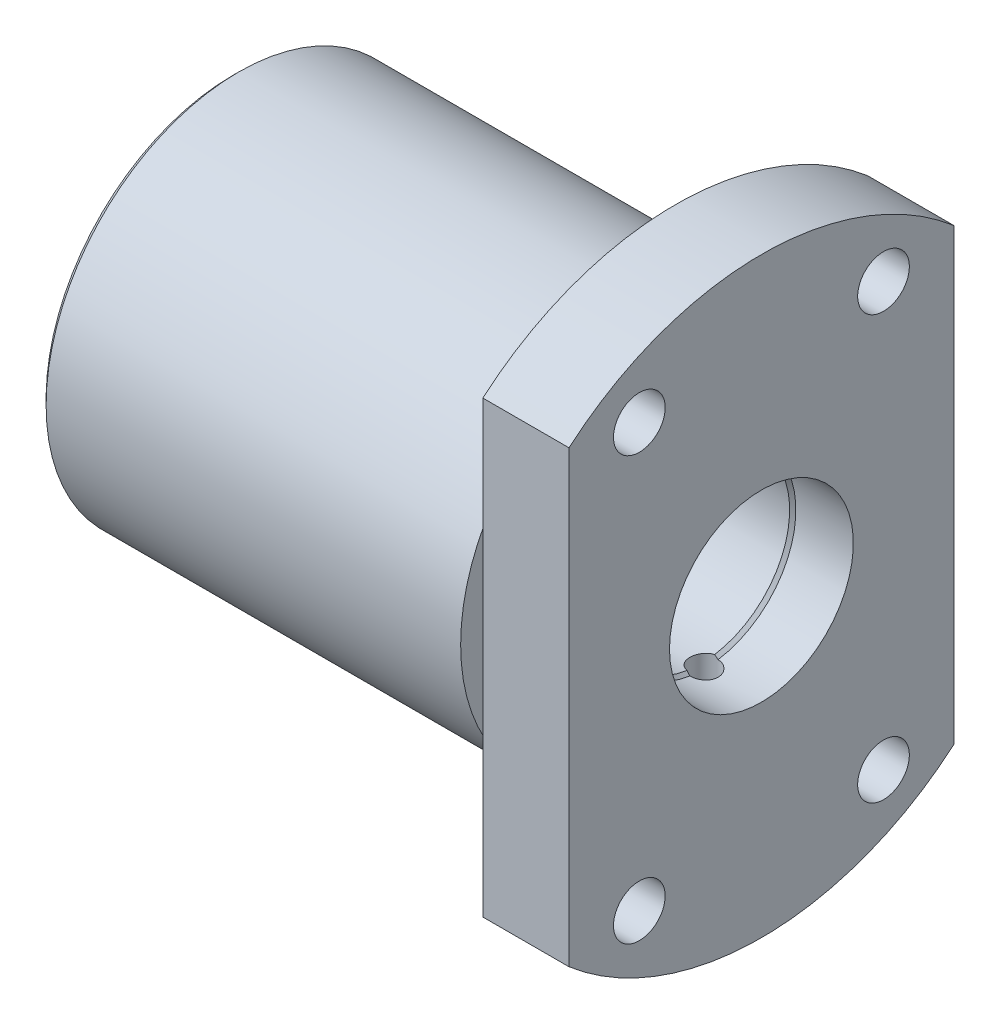
ISO-10303-21;
HEADER;
FILE_DESCRIPTION(('STEP AP214'),'2;1');
FILE_NAME('part.step','',(''),(''),'','','');
FILE_SCHEMA(('AUTOMOTIVE_DESIGN { 1 0 10303 214 1 1 1 1 }'));
ENDSEC;
DATA;
#1=APPLICATION_CONTEXT('core data for automotive mechanical design processes');
#2=APPLICATION_PROTOCOL_DEFINITION('international standard','automotive_design',2000,#1);
#3=PRODUCT_CONTEXT('',#1,'mechanical');
#4=PRODUCT('Part','Part','',(#3));
#5=PRODUCT_RELATED_PRODUCT_CATEGORY('part','',(#4));
#6=PRODUCT_DEFINITION_FORMATION('','',#4);
#7=PRODUCT_DEFINITION_CONTEXT('part definition',#1,'design');
#8=PRODUCT_DEFINITION('design','',#6,#7);
#9=PRODUCT_DEFINITION_SHAPE('','',#8);
#10=(LENGTH_UNIT() NAMED_UNIT(*) SI_UNIT(.MILLI.,.METRE.));
#11=(NAMED_UNIT(*) PLANE_ANGLE_UNIT() SI_UNIT($,.RADIAN.));
#12=(NAMED_UNIT(*) SI_UNIT($,.STERADIAN.) SOLID_ANGLE_UNIT());
#13=UNCERTAINTY_MEASURE_WITH_UNIT(LENGTH_MEASURE(1.E-05),#10,'distance_accuracy_value','');
#14=(GEOMETRIC_REPRESENTATION_CONTEXT(3) GLOBAL_UNCERTAINTY_ASSIGNED_CONTEXT((#13)) GLOBAL_UNIT_ASSIGNED_CONTEXT((#10,
#11,#12)) REPRESENTATION_CONTEXT('',''));
#15=CARTESIAN_POINT('',(0.,0.,0.));
#16=DIRECTION('',(0.,0.,1.));
#17=DIRECTION('',(1.,0.,0.));
#18=AXIS2_PLACEMENT_3D('',#15,#16,#17);
#19=CARTESIAN_POINT('',(92.,0.,0.));
#20=DIRECTION('',(-1.,0.,0.));
#21=DIRECTION('',(0.,0.,1.));
#22=AXIS2_PLACEMENT_3D('',#19,#20,#21);
#23=CYLINDRICAL_SURFACE('',#22,16.);
#24=CARTESIAN_POINT('',(82.,-15.8099898086621,-2.4585));
#25=CARTESIAN_POINT('',(82.0687127932219,-15.8099853369769,-2.45850709908203));
#26=CARTESIAN_POINT('',(82.1374218844522,-15.8104376681935,-2.45561937153529));
#27=CARTESIAN_POINT('',(82.274340392991,-15.8122228647086,-2.44410927692438));
#28=CARTESIAN_POINT('',(82.3425498557513,-15.8135556488796,-2.4354874382172));
#29=CARTESIAN_POINT('',(82.4779093463013,-15.8170666072887,-2.41257771234252));
#30=CARTESIAN_POINT('',(82.5450605348417,-15.8192437768267,-2.39829655852815));
#31=CARTESIAN_POINT('',(82.6778899066993,-15.8243767300692,-2.36419031468206));
#32=CARTESIAN_POINT('',(82.7435680940098,-15.8273325116625,-2.34436523968247));
#33=CARTESIAN_POINT('',(82.9377342524061,-15.8372500387394,-2.27675612791005));
#34=CARTESIAN_POINT('',(83.0634403664738,-15.8452643707128,-2.22082345691879));
#35=CARTESIAN_POINT('',(83.3036133103238,-15.8631896141636,-2.08892663909235));
#36=CARTESIAN_POINT('',(83.4180803435351,-15.8731004913037,-2.0129628549149));
#37=CARTESIAN_POINT('',(83.6335648134979,-15.8937949888385,-1.84246859647142));
#38=CARTESIAN_POINT('',(83.7344764110345,-15.9045845269224,-1.74780483781432));
#39=CARTESIAN_POINT('',(83.9190533772389,-15.9257687684075,-1.5428803625888));
#40=CARTESIAN_POINT('',(84.0027161087039,-15.9361634112347,-1.43261726535531));
#41=CARTESIAN_POINT('',(84.1508110118294,-15.9554483107654,-1.19894157016582));
#42=CARTESIAN_POINT('',(84.2151443513763,-15.9643307385627,-1.07546562858151));
#43=CARTESIAN_POINT('',(84.3221146415374,-15.979523602744,-0.81930871995009));
#44=CARTESIAN_POINT('',(84.364754044294,-15.9858343298004,-0.686628795189169));
#45=CARTESIAN_POINT('',(84.4268062669338,-15.9951312792428,-0.416929076835142));
#46=CARTESIAN_POINT('',(84.4463988381992,-15.9981432172935,-0.27995154159092));
#47=CARTESIAN_POINT('',(84.4623595199437,-16.0005914392365,-0.00461897953302182));
#48=CARTESIAN_POINT('',(84.4587284273068,-16.0000278458177,0.133735999853151));
#49=CARTESIAN_POINT('',(84.4284855469094,-15.9954088803262,0.406661894879526));
#50=CARTESIAN_POINT('',(84.402067787045,-15.9913829904713,0.541254880676761));
#51=CARTESIAN_POINT('',(84.3273063770136,-15.9803246740559,0.804073709817868));
#52=CARTESIAN_POINT('',(84.2789622728503,-15.9732921852425,0.932299421263018));
#53=CARTESIAN_POINT('',(84.1615221571028,-15.9569601320095,1.17933201702674));
#54=CARTESIAN_POINT('',(84.0923444521267,-15.9476516705098,1.29809945164167));
#55=CARTESIAN_POINT('',(83.9352630915317,-15.927804930736,1.52240874270513));
#56=CARTESIAN_POINT('',(83.8473588718804,-15.9172666154238,1.62795020064245));
#57=CARTESIAN_POINT('',(83.6542535085562,-15.8960073393087,1.82394807290087));
#58=CARTESIAN_POINT('',(83.5488851508255,-15.8852856117846,1.91423971597243));
#59=CARTESIAN_POINT('',(83.3243676110274,-15.864969386389,2.07591160506983));
#60=CARTESIAN_POINT('',(83.2052144629526,-15.8553752145339,2.14728638901128));
#61=CARTESIAN_POINT('',(82.9563173112036,-15.8383991045331,2.26912272521137));
#62=CARTESIAN_POINT('',(82.8265585055558,-15.8310203278082,2.31955443013077));
#63=CARTESIAN_POINT('',(82.5603642503339,-15.8193614312876,2.39778957040648));
#64=CARTESIAN_POINT('',(82.4239391305688,-15.8150766701449,2.4256269074916));
#65=CARTESIAN_POINT('',(82.2387461322743,-15.8117199268001,2.44735119459202));
#66=CARTESIAN_POINT('',(82.1910527712408,-15.8110716699053,2.45153382926008));
#67=CARTESIAN_POINT('',(82.0955798191938,-15.8102070714925,2.4571045549549));
#68=CARTESIAN_POINT('',(82.0478005090117,-15.8099900038258,2.45849734428252));
#69=CARTESIAN_POINT('',(82.,-15.8099898086621,2.4585));
#70=B_SPLINE_CURVE_WITH_KNOTS('',3,(#24,#25,#26,#27,#28,#29,#30,#31,#32,#33,#34,#35,#36,#37,#38,
#39,#40,#41,#42,#43,#44,#45,#46,#47,#48,#49,#50,#51,#52,#53,#54,#55,#56,#57,#58,#59,#60,#61,#62,
#63,#64,#65,#66,#67,#68,#69),.UNSPECIFIED.,.F.,.F.,(4,2,2,2,2,2,2,2,2,2,2,2,2,2,2,2,2,2,2,2,2,2,
4),(0.,0.206069692791579,0.412120400377608,0.617926685001745,0.823732411595953,1.23508370058208,
1.64642754267889,2.06081652396368,2.47526881483731,2.89180550454251,3.30829510116602,
3.72151432658785,4.13471937311088,4.54444033728479,4.9541697853316,5.36552727278977,
5.77689715186033,6.19246117259498,6.60814505355324,7.02441933614168,7.44006785911574,
7.58364828127986,7.72698669967308),.UNSPECIFIED.);
#71=CARTESIAN_POINT('',(82.,-15.8099898086621,-2.4585));
#72=VERTEX_POINT('',#71);
#73=CARTESIAN_POINT('',(82.,-15.8099898086621,2.4585));
#74=VERTEX_POINT('',#73);
#75=EDGE_CURVE('E20',#72,#74,#70,.T.);
#76=ORIENTED_EDGE('',*,*,#75,.T.);
#77=CARTESIAN_POINT('',(82.,0.,0.));
#78=DIRECTION('',(1.,0.,0.));
#79=DIRECTION('',(0.,0.,-1.));
#80=AXIS2_PLACEMENT_3D('',#77,#78,#79);
#81=CIRCLE('',#80,16.);
#82=EDGE_CURVE('E72',#74,#72,#81,.F.);
#83=ORIENTED_EDGE('',*,*,#82,.T.);
#84=EDGE_LOOP('',(#76,#83));
#85=FACE_BOUND('',#84,.T.);
#86=CARTESIAN_POINT('',(92.,0.,0.));
#87=DIRECTION('',(-1.,0.,0.));
#88=DIRECTION('',(0.,0.,1.));
#89=AXIS2_PLACEMENT_3D('',#86,#87,#88);
#90=CIRCLE('',#89,16.);
#91=CARTESIAN_POINT('',(92.,0.,16.));
#92=VERTEX_POINT('',#91);
#93=EDGE_CURVE('E186',#92,#92,#90,.T.);
#94=ORIENTED_EDGE('',*,*,#93,.F.);
#95=EDGE_LOOP('',(#94));
#96=FACE_BOUND('',#95,.T.);
#97=ADVANCED_FACE('F16',(#85,#96),#23,.F.);
#98=CARTESIAN_POINT('',(82.,-51.5,0.));
#99=DIRECTION('',(0.,1.,0.));
#100=DIRECTION('',(0.,0.,1.));
#101=AXIS2_PLACEMENT_3D('',#98,#99,#100);
#102=CYLINDRICAL_SURFACE('',#101,2.4585);
#103=CARTESIAN_POINT('',(81.4585,-15.2713529934319,-2.39812426700536));
#104=CARTESIAN_POINT('',(81.3910780216789,-15.2737397803603,-2.38290725331271));
#105=CARTESIAN_POINT('',(81.3243202705034,-15.2765566884271,-2.36483821836498));
#106=CARTESIAN_POINT('',(81.1926010179986,-15.282951201384,-2.32316418537619));
#107=CARTESIAN_POINT('',(81.127639313482,-15.2865287198247,-2.29955981643812));
#108=CARTESIAN_POINT('',(81.0000295255899,-15.2943415095589,-2.24700647346991));
#109=CARTESIAN_POINT('',(80.9373791502979,-15.2985761063415,-2.2180629745285));
#110=CARTESIAN_POINT('',(80.8147753550761,-15.3075802901914,-2.15504571750805));
#111=CARTESIAN_POINT('',(80.7548219505863,-15.3123498803209,-2.12097193006309));
#112=CARTESIAN_POINT('',(80.5796148553959,-15.3272631678293,-2.01138351537136));
#113=CARTESIAN_POINT('',(80.4689219506667,-15.3380173329833,-1.92846368690663));
#114=CARTESIAN_POINT('',(80.263054892967,-15.3599300797512,-1.74535090381237));
#115=CARTESIAN_POINT('',(80.1678800634324,-15.3710886437079,-1.64515870262381));
#116=CARTESIAN_POINT('',(79.9950406752437,-15.3926428734467,-1.42953027341988));
#117=CARTESIAN_POINT('',(79.9174880879411,-15.4030333924198,-1.31400357177649));
#118=CARTESIAN_POINT('',(79.7828910171276,-15.4218062638832,-1.07139978205747));
#119=CARTESIAN_POINT('',(79.7258482542308,-15.4301884478701,-0.94432172603336));
#120=CARTESIAN_POINT('',(79.6341792172695,-15.4439649029716,-0.682805910663233));
#121=CARTESIAN_POINT('',(79.5994533871043,-15.4493724282829,-0.548403780046409));
#122=CARTESIAN_POINT('',(79.5530817816672,-15.4566450326246,-0.275594830985277));
#123=CARTESIAN_POINT('',(79.541432658045,-15.4585106255755,-0.137188596479862));
#124=CARTESIAN_POINT('',(79.5415671952511,-15.4584893968318,0.138089928819826));
#125=CARTESIAN_POINT('',(79.5530956306423,-15.4566434457059,0.274962418898962));
#126=CARTESIAN_POINT('',(79.5987222841412,-15.4494865212363,0.544805516964022));
#127=CARTESIAN_POINT('',(79.632822067685,-15.4441753075597,0.677775853648011));
#128=CARTESIAN_POINT('',(79.7225469890956,-15.4306784829631,0.936006164641517));
#129=CARTESIAN_POINT('',(79.7781616109678,-15.4224942764814,1.06126987117284));
#130=CARTESIAN_POINT('',(79.9093114727122,-15.4041482329107,1.3007209409043));
#131=CARTESIAN_POINT('',(79.9848455640972,-15.3939865098472,1.41490894217205));
#132=CARTESIAN_POINT('',(80.154625639308,-15.3726786000245,1.63028543198387));
#133=CARTESIAN_POINT('',(80.2490631562047,-15.3615230445472,1.7313217851304));
#134=CARTESIAN_POINT('',(80.4536209076665,-15.3395566172026,1.9162248711695));
#135=CARTESIAN_POINT('',(80.5637434075048,-15.3287457953993,2.00008911974228));
#136=CARTESIAN_POINT('',(80.7395307883082,-15.3135968914577,2.11197329529129));
#137=CARTESIAN_POINT('',(80.800638064607,-15.308676451702,2.14726195845542));
#138=CARTESIAN_POINT('',(80.9257089038142,-15.2993861807142,2.21248469608573));
#139=CARTESIAN_POINT('',(80.9896725125215,-15.295016358315,2.24241868465577));
#140=CARTESIAN_POINT('',(81.1200491931278,-15.2869579409856,2.29671526095564));
#141=CARTESIAN_POINT('',(81.1864650875412,-15.2832701623718,2.32107118067152));
#142=CARTESIAN_POINT('',(81.3211885140459,-15.2766888981087,2.36398924894072));
#143=CARTESIAN_POINT('',(81.3894962393417,-15.2737954939172,2.38255080334761));
#144=CARTESIAN_POINT('',(81.4585,-15.2713529934319,2.39812426700536));
#145=B_SPLINE_CURVE_WITH_KNOTS('',3,(#103,#104,#105,#106,#107,#108,#109,#110,#111,#112,#113,
#114,#115,#116,#117,#118,#119,#120,#121,#122,#123,#124,#125,#126,#127,#128,#129,#130,#131,#132,
#133,#134,#135,#136,#137,#138,#139,#140,#141,#142,#143,#144),.UNSPECIFIED.,.F.,.F.,(4,2,2,2,2,2,
2,2,2,2,2,2,2,2,2,2,2,2,2,2,4),(0.,0.207406012139597,0.414788463539823,0.621959422004962,
0.829131566368304,1.24317938164911,1.65720914025122,2.07380032619091,2.49042645272517,
2.90518086178485,3.31987508700672,3.73002781633368,4.14020899478755,4.55018993821421,
4.96014724873238,5.37449023246296,5.7888931176642,6.00088401305302,6.21287830875459,
6.42512471451752,6.63739287659836),.UNSPECIFIED.);
#146=CARTESIAN_POINT('',(81.4585,-15.2713529934319,-2.39812426700536));
#147=VERTEX_POINT('',#146);
#148=CARTESIAN_POINT('',(81.4585,-15.2713529934319,2.39812426700536));
#149=VERTEX_POINT('',#148);
#150=EDGE_CURVE('E83',#147,#149,#145,.T.);
#151=ORIENTED_EDGE('',*,*,#150,.T.);
#152=CARTESIAN_POINT('',(81.4585,-15.2713529934319,2.39812426700537));
#153=CARTESIAN_POINT('',(81.5036759298067,-15.3154802436735,2.40832332934761));
#154=CARTESIAN_POINT('',(81.5488977720816,-15.3598628502402,2.41719467889737));
#155=CARTESIAN_POINT('',(81.6392848441635,-15.4489815517865,2.43232504325639));
#156=CARTESIAN_POINT('',(81.6844500475292,-15.4937169605573,2.43858825158658));
#157=CARTESIAN_POINT('',(81.7747209133983,-15.583526234397,2.44857789563526));
#158=CARTESIAN_POINT('',(81.8198265769642,-15.6286000933275,2.45230437724934));
#159=CARTESIAN_POINT('',(81.909986651207,-15.7190817890225,2.45726669444199));
#160=CARTESIAN_POINT('',(81.9550408611398,-15.7644900479091,2.45849849377948));
#161=CARTESIAN_POINT('',(82.,-15.8099898086621,2.4585));
#162=B_SPLINE_CURVE_WITH_KNOTS('',3,(#152,#153,#154,#155,#156,#157,#158,#159,#160,#161),
.UNSPECIFIED.,.F.,.F.,(4,2,2,2,4),(0.,0.191889753889479,0.383469773765051,0.575046327398133,
0.766932593175487),.UNSPECIFIED.);
#163=EDGE_CURVE('E78',#149,#74,#162,.T.);
#164=ORIENTED_EDGE('',*,*,#163,.T.);
#165=ORIENTED_EDGE('',*,*,#75,.F.);
#166=CARTESIAN_POINT('',(82.,-15.8099898086621,-2.4585));
#167=CARTESIAN_POINT('',(81.9550408611398,-15.7644900479091,-2.45849849377948));
#168=CARTESIAN_POINT('',(81.909986651207,-15.7190817890225,-2.45726669444199));
#169=CARTESIAN_POINT('',(81.8198265769642,-15.6286000933275,-2.45230437724934));
#170=CARTESIAN_POINT('',(81.7747209133983,-15.583526234397,-2.44857789563526));
#171=CARTESIAN_POINT('',(81.6844500475292,-15.4937169605573,-2.43858825158658));
#172=CARTESIAN_POINT('',(81.6392848441635,-15.4489815517864,-2.43232504325639));
#173=CARTESIAN_POINT('',(81.5488977720815,-15.3598628502401,-2.41719467889737));
#174=CARTESIAN_POINT('',(81.5036759298067,-15.3154802436735,-2.40832332934761));
#175=CARTESIAN_POINT('',(81.4585,-15.2713529934319,-2.39812426700536));
#176=B_SPLINE_CURVE_WITH_KNOTS('',3,(#166,#167,#168,#169,#170,#171,#172,#173,#174,#175),
.UNSPECIFIED.,.F.,.F.,(4,2,2,2,4),(0.,0.191886265777359,0.383462819410451,0.575042839286044,
0.76693259317551),.UNSPECIFIED.);
#177=EDGE_CURVE('E88',#72,#147,#176,.T.);
#178=ORIENTED_EDGE('',*,*,#177,.T.);
#179=EDGE_LOOP('',(#151,#164,#165,#178));
#180=FACE_BOUND('',#179,.T.);
#181=CARTESIAN_POINT('',(82.,-50.9584999999788,0.));
#182=DIRECTION('',(0.,-1.,0.));
#183=DIRECTION('',(0.,0.,-1.));
#184=AXIS2_PLACEMENT_3D('',#181,#182,#183);
#185=CIRCLE('',#184,2.45849999993197);
#186=CARTESIAN_POINT('',(82.,-50.9584999999788,-2.45849999993197));
#187=VERTEX_POINT('',#186);
#188=EDGE_CURVE('E90',#187,#187,#185,.T.);
#189=ORIENTED_EDGE('',*,*,#188,.T.);
#190=EDGE_LOOP('',(#189));
#191=FACE_BOUND('',#190,.T.);
#192=ADVANCED_FACE('F80',(#180,#191),#102,.F.);
#193=CARTESIAN_POINT('',(82.,0.,0.));
#194=DIRECTION('',(1.,0.,0.));
#195=DIRECTION('',(0.,0.,-1.));
#196=AXIS2_PLACEMENT_3D('',#193,#194,#195);
#197=CONICAL_SURFACE('',#196,16.,0.785398163397453);
#198=ORIENTED_EDGE('',*,*,#82,.F.);
#199=ORIENTED_EDGE('',*,*,#163,.F.);
#200=CARTESIAN_POINT('',(81.4585,0.,0.));
#201=DIRECTION('',(-1.,0.,0.));
#202=DIRECTION('',(0.,0.,1.));
#203=AXIS2_PLACEMENT_3D('',#200,#201,#202);
#204=CIRCLE('',#203,15.4585);
#205=EDGE_CURVE('E185',#149,#147,#204,.T.);
#206=ORIENTED_EDGE('',*,*,#205,.T.);
#207=ORIENTED_EDGE('',*,*,#177,.F.);
#208=EDGE_LOOP('',(#198,#199,#206,#207));
#209=FACE_BOUND('',#208,.T.);
#210=ADVANCED_FACE('F87',(#209),#197,.F.);
#211=CARTESIAN_POINT('',(82.,-51.5040665326865,0.));
#212=DIRECTION('',(0.,-1.,0.));
#213=DIRECTION('',(0.,0.,-1.));
#214=AXIS2_PLACEMENT_3D('',#211,#212,#213);
#215=CONICAL_SURFACE('',#214,3.00406653263963,0.785398163397448);
#216=ORIENTED_EDGE('',*,*,#188,.F.);
#217=EDGE_LOOP('',(#216));
#218=FACE_BOUND('',#217,.T.);
#219=CARTESIAN_POINT('',(79.8051589945677,-51.4615997970434,-1.98840295695641));
#220=CARTESIAN_POINT('',(79.7036992617387,-51.465691431278,-1.88250120849598));
#221=CARTESIAN_POINT('',(79.6101225277162,-51.4697484980506,-1.76900539831044));
#222=CARTESIAN_POINT('',(79.4410382540887,-51.4774323729293,-1.52916844874081));
#223=CARTESIAN_POINT('',(79.3655415099659,-51.4810589233274,-1.40281969874808));
#224=CARTESIAN_POINT('',(79.2268739406098,-51.487931810918,-1.1244666556326));
#225=CARTESIAN_POINT('',(79.1662196770519,-51.4910823403697,-0.971195806943157));
#226=CARTESIAN_POINT('',(79.0721385653064,-51.4960561225166,-0.656474685282121));
#227=CARTESIAN_POINT('',(79.0387147785695,-51.4978792259704,-0.495023494783076));
#228=CARTESIAN_POINT('',(79.0006983642025,-51.4999583255308,-0.172414192500032));
#229=CARTESIAN_POINT('',(78.9954782494142,-51.5002484253,-0.0113301299559985));
#230=CARTESIAN_POINT('',(79.0123607505675,-51.4993203502922,0.309377177378493));
#231=CARTESIAN_POINT('',(79.0344600764734,-51.4981023571324,0.469000595739963));
#232=CARTESIAN_POINT('',(79.1049385614379,-51.4943129313853,0.780957113699572));
#233=CARTESIAN_POINT('',(79.153105578072,-51.4917524294932,0.933338406926496));
#234=CARTESIAN_POINT('',(79.2740101527879,-51.4855687192546,1.22798735224299));
#235=CARTESIAN_POINT('',(79.3467489997529,-51.4819454551636,1.37025447333301));
#236=CARTESIAN_POINT('',(79.5155723709028,-51.4739804910187,1.64260397548636));
#237=CARTESIAN_POINT('',(79.6119347949951,-51.4696304512075,1.77251368405949));
#238=CARTESIAN_POINT('',(79.8246030571859,-51.460715803408,2.01480989937809));
#239=CARTESIAN_POINT('',(79.9409112207937,-51.456151170445,2.127194359903));
#240=CARTESIAN_POINT('',(80.1933250195504,-51.4471764900341,2.33432608075841));
#241=CARTESIAN_POINT('',(80.3298598385672,-51.4427733520472,2.42855055202575));
#242=CARTESIAN_POINT('',(80.6165040145131,-51.4347251824693,2.59343066126914));
#243=CARTESIAN_POINT('',(80.7666151872771,-51.4310802525042,2.66408314055208));
#244=CARTESIAN_POINT('',(81.0803380360376,-51.4248559268425,2.78168551012664));
#245=CARTESIAN_POINT('',(81.2441990571257,-51.4223066565513,2.82797229816844));
#246=CARTESIAN_POINT('',(81.5773271640058,-51.4186944405713,2.89290992133447));
#247=CARTESIAN_POINT('',(81.7465948019959,-51.4176316472017,2.91155792432617));
#248=CARTESIAN_POINT('',(82.0886623013585,-51.4171046318934,2.92085278312531));
#249=CARTESIAN_POINT('',(82.2614748786295,-51.4176666553468,2.91103990691588));
#250=CARTESIAN_POINT('',(82.6030208622307,-51.4203833322818,2.86264823596193));
#251=CARTESIAN_POINT('',(82.7717541035619,-51.422538050073,2.82406827966435));
#252=CARTESIAN_POINT('',(83.1006074507077,-51.4282013085117,2.71898262575423));
#253=CARTESIAN_POINT('',(83.2607118162718,-51.4317122337603,2.65242772190157));
#254=CARTESIAN_POINT('',(83.5672513881657,-51.4396836280221,2.49304732704595));
#255=CARTESIAN_POINT('',(83.7136872239288,-51.44414405328,2.40022304653772));
#256=CARTESIAN_POINT('',(83.9865209322261,-51.4534272986551,2.19214157282472));
#257=CARTESIAN_POINT('',(84.1131624186282,-51.458244419853,2.07720381451582));
#258=CARTESIAN_POINT('',(84.3447298658776,-51.4677273383712,1.8271959678649));
#259=CARTESIAN_POINT('',(84.4496588799069,-51.4723931568898,1.69212871470986));
#260=CARTESIAN_POINT('',(84.6319466991608,-51.4809020214333,1.40932683167531));
#261=CARTESIAN_POINT('',(84.7099359776958,-51.4847628999848,1.26199923890856));
#262=CARTESIAN_POINT('',(84.8393092893866,-51.4913516964891,0.956068081697352));
#263=CARTESIAN_POINT('',(84.8906979447907,-51.4940798112598,0.797466481728007));
#264=CARTESIAN_POINT('',(84.9640709267885,-51.498021992901,0.478066715163643));
#265=CARTESIAN_POINT('',(84.9868063449281,-51.4992746750137,0.317441316486738));
#266=CARTESIAN_POINT('',(85.0045970196319,-51.5002524526581,-0.00533319575282863));
#267=CARTESIAN_POINT('',(84.9996551478605,-51.4999777066686,-0.167482149495901));
#268=CARTESIAN_POINT('',(84.9625357814352,-51.4979475759517,-0.486270218086885));
#269=CARTESIAN_POINT('',(84.9307463397534,-51.4962132885844,-0.64295488717846));
#270=CARTESIAN_POINT('',(84.8415016757597,-51.4914864571291,-0.948805487729586));
#271=CARTESIAN_POINT('',(84.7840462011399,-51.4884939006719,-1.09797134525998));
#272=CARTESIAN_POINT('',(84.6448783661259,-51.4815585230614,-1.38563590607772));
#273=CARTESIAN_POINT('',(84.5630166915563,-51.4776098814734,-1.52406213788456));
#274=CARTESIAN_POINT('',(84.3777079026889,-51.4692025116055,-1.7855931496718));
#275=CARTESIAN_POINT('',(84.2742586089053,-51.4647437318425,-1.90869638063729));
#276=CARTESIAN_POINT('',(84.0462488004506,-51.4556879975202,-2.13911050352455));
#277=CARTESIAN_POINT('',(83.9212631797281,-51.4510902007899,-2.24600053290326));
#278=CARTESIAN_POINT('',(83.6555117930852,-51.4423529666933,-2.43794579081332));
#279=CARTESIAN_POINT('',(83.5147438729198,-51.438213592054,-2.52299803331504));
#280=CARTESIAN_POINT('',(83.2173184356609,-51.4307304402692,-2.67126409593066));
#281=CARTESIAN_POINT('',(83.0603331509449,-51.427411330699,-2.73382189728332));
#282=CARTESIAN_POINT('',(82.7382034665381,-51.4220814636206,-2.83231069066007));
#283=CARTESIAN_POINT('',(82.5730583228098,-51.42007082566,-2.86823924976264));
#284=CARTESIAN_POINT('',(82.2357562342502,-51.4175504444709,-2.91307999999442));
#285=CARTESIAN_POINT('',(82.0635251095498,-51.4170715308245,-2.92143735860934));
#286=CARTESIAN_POINT('',(81.7200402221539,-51.4177554403325,-2.90937406159457));
#287=CARTESIAN_POINT('',(81.5487866807463,-51.4189186214675,-2.88894713092163));
#288=CARTESIAN_POINT('',(81.2109498863284,-51.4227700338891,-2.81956182080714));
#289=CARTESIAN_POINT('',(81.0444067698606,-51.4254686807155,-2.77040851900902));
#290=CARTESIAN_POINT('',(80.7221449574252,-51.4320896313378,-2.64463517859241));
#291=CARTESIAN_POINT('',(80.5664180589891,-51.4360109952204,-2.56803623096122));
#292=CARTESIAN_POINT('',(80.3060339322865,-51.4435823143098,-2.41089570961528));
#293=CARTESIAN_POINT('',(80.1980946868229,-51.4470712084502,-2.33572076887366));
#294=CARTESIAN_POINT('',(79.9930550092593,-51.4542492747543,-2.17185538858143));
#295=CARTESIAN_POINT('',(79.8959507825896,-51.4579383761256,-2.0831697065749));
#296=CARTESIAN_POINT('',(79.8051589945677,-51.4615997970434,-1.98840295695641));
#297=B_SPLINE_CURVE_WITH_KNOTS('',3,(#219,#220,#221,#222,#223,#224,#225,#226,#227,#228,#229,
#230,#231,#232,#233,#234,#235,#236,#237,#238,#239,#240,#241,#242,#243,#244,#245,#246,#247,#248,
#249,#250,#251,#252,#253,#254,#255,#256,#257,#258,#259,#260,#261,#262,#263,#264,#265,#266,#267,
#268,#269,#270,#271,#272,#273,#274,#275,#276,#277,#278,#279,#280,#281,#282,#283,#284,#285,#286,
#287,#288,#289,#290,#291,#292,#293,#294,#295,#296),.UNSPECIFIED.,.T.,.F.,(4,2,2,2,2,2,2,2,2,2,2,
2,2,2,2,2,2,2,2,2,2,2,2,2,2,2,2,2,2,2,2,2,2,2,2,2,2,2,4),(0.,0.439778368807783,
0.879818676255873,1.37194252262355,1.86412168954497,2.34530413249902,2.82642863308262,
3.30369529689442,3.7809869989901,4.26418820815161,4.7474457929563,5.24302566991179,
5.73867192889383,6.24718822157074,6.75575661805706,7.27258550232045,7.78943525615662,
8.30719794711101,8.82493678340791,9.33569292703566,9.84637719985823,10.3441386131458,
10.8418135040305,11.3261513629113,11.8104389701253,12.287844197891,12.7652541188567,
13.2456468984578,13.7260882019921,14.2174117559294,14.7088024561542,15.2135420596328,
15.7183277718408,16.2332115707662,16.7482076329462,17.2667394465336,17.784873638776,
18.178549985569,18.5720880259726),.UNSPECIFIED.);
#298=CARTESIAN_POINT('',(79.8051589945677,-51.4615997970434,-1.98840295695641));
#299=VERTEX_POINT('',#298);
#300=EDGE_CURVE('E147',#299,#299,#297,.T.);
#301=ORIENTED_EDGE('',*,*,#300,.F.);
#302=EDGE_LOOP('',(#301));
#303=FACE_BOUND('',#302,.T.);
#304=ADVANCED_FACE('F159',(#218,#303),#215,.F.);
#305=CARTESIAN_POINT('',(92.,0.,0.));
#306=DIRECTION('',(1.,0.,0.));
#307=DIRECTION('',(0.,0.,-1.));
#308=AXIS2_PLACEMENT_3D('',#305,#306,#307);
#309=PLANE('',#308);
#310=ORIENTED_EDGE('',*,*,#93,.T.);
#311=EDGE_LOOP('',(#310));
#312=FACE_BOUND('',#311,.T.);
#313=CARTESIAN_POINT('',(92.,-36.8060796608386,21.25));
#314=DIRECTION('',(1.,0.,0.));
#315=DIRECTION('',(0.,0.,-1.));
#316=AXIS2_PLACEMENT_3D('',#313,#314,#315);
#317=CIRCLE('',#316,4.5);
#318=CARTESIAN_POINT('',(92.,-36.8060796608386,16.75));
#319=VERTEX_POINT('',#318);
#320=EDGE_CURVE('E129',#319,#319,#317,.F.);
#321=ORIENTED_EDGE('',*,*,#320,.T.);
#322=EDGE_LOOP('',(#321));
#323=FACE_BOUND('',#322,.T.);
#324=CARTESIAN_POINT('',(92.,36.8060796608386,21.25));
#325=DIRECTION('',(1.,0.,0.));
#326=DIRECTION('',(0.,0.,-1.));
#327=AXIS2_PLACEMENT_3D('',#324,#325,#326);
#328=CIRCLE('',#327,4.5);
#329=CARTESIAN_POINT('',(92.,36.8060796608386,16.75));
#330=VERTEX_POINT('',#329);
#331=EDGE_CURVE('E133',#330,#330,#328,.F.);
#332=ORIENTED_EDGE('',*,*,#331,.T.);
#333=EDGE_LOOP('',(#332));
#334=FACE_BOUND('',#333,.T.);
#335=CARTESIAN_POINT('',(92.,36.8060796608386,-21.25));
#336=DIRECTION('',(1.,0.,0.));
#337=DIRECTION('',(0.,0.,-1.));
#338=AXIS2_PLACEMENT_3D('',#335,#336,#337);
#339=CIRCLE('',#338,4.5);
#340=CARTESIAN_POINT('',(92.,36.8060796608386,-25.75));
#341=VERTEX_POINT('',#340);
#342=EDGE_CURVE('E136',#341,#341,#339,.F.);
#343=ORIENTED_EDGE('',*,*,#342,.T.);
#344=EDGE_LOOP('',(#343));
#345=FACE_BOUND('',#344,.T.);
#346=CARTESIAN_POINT('',(92.,-36.8060796608386,-21.25));
#347=DIRECTION('',(1.,0.,0.));
#348=DIRECTION('',(0.,0.,-1.));
#349=AXIS2_PLACEMENT_3D('',#346,#347,#348);
#350=CIRCLE('',#349,4.5);
#351=CARTESIAN_POINT('',(92.,-36.8060796608386,-25.75));
#352=VERTEX_POINT('',#351);
#353=EDGE_CURVE('E139',#352,#352,#350,.F.);
#354=ORIENTED_EDGE('',*,*,#353,.T.);
#355=EDGE_LOOP('',(#354));
#356=FACE_BOUND('',#355,.T.);
#357=CARTESIAN_POINT('',(92.,0.,0.));
#358=DIRECTION('',(1.,0.,0.));
#359=DIRECTION('',(0.,0.,-1.));
#360=AXIS2_PLACEMENT_3D('',#357,#358,#359);
#361=CIRCLE('',#360,51.5);
#362=CARTESIAN_POINT('',(92.,-39.1152144312159,-33.5));
#363=VERTEX_POINT('',#362);
#364=CARTESIAN_POINT('',(92.,-39.1152144312159,33.5));
#365=VERTEX_POINT('',#364);
#366=EDGE_CURVE('E157',#363,#365,#361,.F.);
#367=ORIENTED_EDGE('',*,*,#366,.F.);
#368=DIRECTION('',(0.,1.,0.));
#369=VECTOR('',#368,1.);
#370=CARTESIAN_POINT('',(92.,-39.1152144312159,-33.5));
#371=LINE('',#370,#369);
#372=CARTESIAN_POINT('',(92.,39.1152144312159,-33.5));
#373=VERTEX_POINT('',#372);
#374=EDGE_CURVE('E272',#363,#373,#371,.T.);
#375=ORIENTED_EDGE('',*,*,#374,.T.);
#376=CARTESIAN_POINT('',(92.,0.,0.));
#377=DIRECTION('',(1.,0.,0.));
#378=DIRECTION('',(0.,0.,-1.));
#379=AXIS2_PLACEMENT_3D('',#376,#377,#378);
#380=CIRCLE('',#379,51.5);
#381=CARTESIAN_POINT('',(92.,39.1152144312159,33.5));
#382=VERTEX_POINT('',#381);
#383=EDGE_CURVE('E143',#382,#373,#380,.F.);
#384=ORIENTED_EDGE('',*,*,#383,.F.);
#385=DIRECTION('',(0.,1.,0.));
#386=VECTOR('',#385,1.);
#387=CARTESIAN_POINT('',(92.,39.1152144312159,33.5));
#388=LINE('',#387,#386);
#389=EDGE_CURVE('E269',#382,#365,#388,.F.);
#390=ORIENTED_EDGE('',*,*,#389,.T.);
#391=EDGE_LOOP('',(#367,#375,#384,#390));
#392=FACE_BOUND('',#391,.T.);
#393=ADVANCED_FACE('F178',(#312,#323,#334,#345,#356,#392),#309,.T.);
#394=CARTESIAN_POINT('',(92.,0.,0.));
#395=DIRECTION('',(-1.,0.,0.));
#396=DIRECTION('',(0.,0.,1.));
#397=AXIS2_PLACEMENT_3D('',#394,#395,#396);
#398=CYLINDRICAL_SURFACE('',#397,15.4585);
#399=CARTESIAN_POINT('',(10.5415,0.,0.));
#400=DIRECTION('',(-1.,0.,0.));
#401=DIRECTION('',(0.,0.,1.));
#402=AXIS2_PLACEMENT_3D('',#399,#400,#401);
#403=CIRCLE('',#402,15.4585);
#404=CARTESIAN_POINT('',(10.5415,0.,15.4585));
#405=VERTEX_POINT('',#404);
#406=EDGE_CURVE('E132',#405,#405,#403,.T.);
#407=ORIENTED_EDGE('',*,*,#406,.T.);
#408=EDGE_LOOP('',(#407));
#409=FACE_BOUND('',#408,.T.);
#410=ORIENTED_EDGE('',*,*,#150,.F.);
#411=ORIENTED_EDGE('',*,*,#205,.F.);
#412=EDGE_LOOP('',(#410,#411));
#413=FACE_BOUND('',#412,.T.);
#414=ADVANCED_FACE('F174',(#409,#413),#398,.F.);
#415=CARTESIAN_POINT('',(92.,39.1152144312159,33.5));
#416=DIRECTION('',(0.,0.,-1.));
#417=DIRECTION('',(-1.,0.,0.));
#418=AXIS2_PLACEMENT_3D('',#415,#416,#417);
#419=PLANE('',#418);
#420=DIRECTION('',(1.,0.,0.));
#421=VECTOR('',#420,1.);
#422=CARTESIAN_POINT('',(92.,-39.1152144312159,33.5));
#423=LINE('',#422,#421);
#424=CARTESIAN_POINT('',(77.,-39.1152144312159,33.5));
#425=VERTEX_POINT('',#424);
#426=EDGE_CURVE('E156',#365,#425,#423,.F.);
#427=ORIENTED_EDGE('',*,*,#426,.F.);
#428=ORIENTED_EDGE('',*,*,#389,.F.);
#429=DIRECTION('',(1.,0.,0.));
#430=VECTOR('',#429,1.);
#431=CARTESIAN_POINT('',(92.,39.1152144312159,33.5));
#432=LINE('',#431,#430);
#433=CARTESIAN_POINT('',(77.,39.1152144312159,33.5));
#434=VERTEX_POINT('',#433);
#435=EDGE_CURVE('E146',#434,#382,#432,.T.);
#436=ORIENTED_EDGE('',*,*,#435,.F.);
#437=DIRECTION('',(0.,1.,0.));
#438=VECTOR('',#437,1.);
#439=CARTESIAN_POINT('',(77.,0.,33.5));
#440=LINE('',#439,#438);
#441=EDGE_CURVE('E128',#434,#425,#440,.F.);
#442=ORIENTED_EDGE('',*,*,#441,.T.);
#443=EDGE_LOOP('',(#427,#428,#436,#442));
#444=FACE_BOUND('',#443,.T.);
#445=ADVANCED_FACE('F169',(#444),#419,.F.);
#446=CARTESIAN_POINT('',(92.,0.,0.));
#447=DIRECTION('',(1.,0.,0.));
#448=DIRECTION('',(0.,0.,-1.));
#449=AXIS2_PLACEMENT_3D('',#446,#447,#448);
#450=CYLINDRICAL_SURFACE('',#449,51.5);
#451=ORIENTED_EDGE('',*,*,#300,.T.);
#452=EDGE_LOOP('',(#451));
#453=FACE_BOUND('',#452,.T.);
#454=ORIENTED_EDGE('',*,*,#366,.T.);
#455=ORIENTED_EDGE('',*,*,#426,.T.);
#456=CARTESIAN_POINT('',(77.,0.,0.));
#457=DIRECTION('',(1.,0.,0.));
#458=DIRECTION('',(0.,0.,-1.));
#459=AXIS2_PLACEMENT_3D('',#456,#457,#458);
#460=CIRCLE('',#459,51.5);
#461=CARTESIAN_POINT('',(77.,-39.1152144312159,-33.5));
#462=VERTEX_POINT('',#461);
#463=EDGE_CURVE('E126',#425,#462,#460,.T.);
#464=ORIENTED_EDGE('',*,*,#463,.T.);
#465=DIRECTION('',(1.,0.,0.));
#466=VECTOR('',#465,1.);
#467=CARTESIAN_POINT('',(92.,-39.1152144312159,-33.5));
#468=LINE('',#467,#466);
#469=EDGE_CURVE('E155',#462,#363,#468,.T.);
#470=ORIENTED_EDGE('',*,*,#469,.T.);
#471=EDGE_LOOP('',(#454,#455,#464,#470));
#472=FACE_BOUND('',#471,.T.);
#473=ADVANCED_FACE('F163',(#453,#472),#450,.T.);
#474=CARTESIAN_POINT('',(92.,-39.1152144312159,-33.5));
#475=DIRECTION('',(0.,0.,1.));
#476=DIRECTION('',(1.,0.,0.));
#477=AXIS2_PLACEMENT_3D('',#474,#475,#476);
#478=PLANE('',#477);
#479=DIRECTION('',(1.,0.,0.));
#480=VECTOR('',#479,1.);
#481=CARTESIAN_POINT('',(92.,39.1152144312159,-33.5));
#482=LINE('',#481,#480);
#483=CARTESIAN_POINT('',(77.,39.1152144312159,-33.5));
#484=VERTEX_POINT('',#483);
#485=EDGE_CURVE('E142',#373,#484,#482,.F.);
#486=ORIENTED_EDGE('',*,*,#485,.F.);
#487=ORIENTED_EDGE('',*,*,#374,.F.);
#488=ORIENTED_EDGE('',*,*,#469,.F.);
#489=DIRECTION('',(0.,1.,0.));
#490=VECTOR('',#489,1.);
#491=CARTESIAN_POINT('',(77.,0.,-33.5));
#492=LINE('',#491,#490);
#493=EDGE_CURVE('E39',#462,#484,#492,.T.);
#494=ORIENTED_EDGE('',*,*,#493,.T.);
#495=EDGE_LOOP('',(#486,#487,#488,#494));
#496=FACE_BOUND('',#495,.T.);
#497=ADVANCED_FACE('F168',(#496),#478,.F.);
#498=CARTESIAN_POINT('',(92.,0.,0.));
#499=DIRECTION('',(1.,0.,0.));
#500=DIRECTION('',(0.,0.,-1.));
#501=AXIS2_PLACEMENT_3D('',#498,#499,#500);
#502=CYLINDRICAL_SURFACE('',#501,51.5);
#503=ORIENTED_EDGE('',*,*,#383,.T.);
#504=ORIENTED_EDGE('',*,*,#485,.T.);
#505=CARTESIAN_POINT('',(77.,0.,0.));
#506=DIRECTION('',(1.,0.,0.));
#507=DIRECTION('',(0.,0.,-1.));
#508=AXIS2_PLACEMENT_3D('',#505,#506,#507);
#509=CIRCLE('',#508,51.5);
#510=EDGE_CURVE('E123',#484,#434,#509,.T.);
#511=ORIENTED_EDGE('',*,*,#510,.T.);
#512=ORIENTED_EDGE('',*,*,#435,.T.);
#513=EDGE_LOOP('',(#503,#504,#511,#512));
#514=FACE_BOUND('',#513,.T.);
#515=ADVANCED_FACE('F258',(#514),#502,.T.);
#516=CARTESIAN_POINT('',(92.,-36.8060796608386,-21.25));
#517=DIRECTION('',(1.,0.,0.));
#518=DIRECTION('',(0.,0.,-1.));
#519=AXIS2_PLACEMENT_3D('',#516,#517,#518);
#520=CYLINDRICAL_SURFACE('',#519,4.5);
#521=CARTESIAN_POINT('',(77.,-36.8060796608386,-21.25));
#522=DIRECTION('',(1.,0.,0.));
#523=DIRECTION('',(0.,0.,-1.));
#524=AXIS2_PLACEMENT_3D('',#521,#522,#523);
#525=CIRCLE('',#524,4.5);
#526=CARTESIAN_POINT('',(77.,-36.8060796608386,-25.75));
#527=VERTEX_POINT('',#526);
#528=EDGE_CURVE('E120',#527,#527,#525,.F.);
#529=ORIENTED_EDGE('',*,*,#528,.T.);
#530=EDGE_LOOP('',(#529));
#531=FACE_BOUND('',#530,.T.);
#532=ORIENTED_EDGE('',*,*,#353,.F.);
#533=EDGE_LOOP('',(#532));
#534=FACE_BOUND('',#533,.T.);
#535=ADVANCED_FACE('F255',(#531,#534),#520,.F.);
#536=CARTESIAN_POINT('',(92.,36.8060796608386,-21.25));
#537=DIRECTION('',(1.,0.,0.));
#538=DIRECTION('',(0.,0.,-1.));
#539=AXIS2_PLACEMENT_3D('',#536,#537,#538);
#540=CYLINDRICAL_SURFACE('',#539,4.5);
#541=CARTESIAN_POINT('',(77.,36.8060796608386,-21.25));
#542=DIRECTION('',(1.,0.,0.));
#543=DIRECTION('',(0.,0.,-1.));
#544=AXIS2_PLACEMENT_3D('',#541,#542,#543);
#545=CIRCLE('',#544,4.5);
#546=CARTESIAN_POINT('',(77.,36.8060796608386,-25.75));
#547=VERTEX_POINT('',#546);
#548=EDGE_CURVE('E117',#547,#547,#545,.F.);
#549=ORIENTED_EDGE('',*,*,#548,.T.);
#550=EDGE_LOOP('',(#549));
#551=FACE_BOUND('',#550,.T.);
#552=ORIENTED_EDGE('',*,*,#342,.F.);
#553=EDGE_LOOP('',(#552));
#554=FACE_BOUND('',#553,.T.);
#555=ADVANCED_FACE('F251',(#551,#554),#540,.F.);
#556=CARTESIAN_POINT('',(92.,36.8060796608386,21.25));
#557=DIRECTION('',(1.,0.,0.));
#558=DIRECTION('',(0.,0.,-1.));
#559=AXIS2_PLACEMENT_3D('',#556,#557,#558);
#560=CYLINDRICAL_SURFACE('',#559,4.5);
#561=CARTESIAN_POINT('',(77.,36.8060796608386,21.25));
#562=DIRECTION('',(1.,0.,0.));
#563=DIRECTION('',(0.,0.,-1.));
#564=AXIS2_PLACEMENT_3D('',#561,#562,#563);
#565=CIRCLE('',#564,4.5);
#566=CARTESIAN_POINT('',(77.,36.8060796608386,16.75));
#567=VERTEX_POINT('',#566);
#568=EDGE_CURVE('E114',#567,#567,#565,.F.);
#569=ORIENTED_EDGE('',*,*,#568,.T.);
#570=EDGE_LOOP('',(#569));
#571=FACE_BOUND('',#570,.T.);
#572=ORIENTED_EDGE('',*,*,#331,.F.);
#573=EDGE_LOOP('',(#572));
#574=FACE_BOUND('',#573,.T.);
#575=ADVANCED_FACE('F247',(#571,#574),#560,.F.);
#576=CARTESIAN_POINT('',(92.,-36.8060796608386,21.25));
#577=DIRECTION('',(1.,0.,0.));
#578=DIRECTION('',(0.,0.,-1.));
#579=AXIS2_PLACEMENT_3D('',#576,#577,#578);
#580=CYLINDRICAL_SURFACE('',#579,4.5);
#581=CARTESIAN_POINT('',(77.,-36.8060796608386,21.25));
#582=DIRECTION('',(1.,0.,0.));
#583=DIRECTION('',(0.,0.,-1.));
#584=AXIS2_PLACEMENT_3D('',#581,#582,#583);
#585=CIRCLE('',#584,4.5);
#586=CARTESIAN_POINT('',(77.,-36.8060796608386,16.75));
#587=VERTEX_POINT('',#586);
#588=EDGE_CURVE('E111',#587,#587,#585,.F.);
#589=ORIENTED_EDGE('',*,*,#588,.T.);
#590=EDGE_LOOP('',(#589));
#591=FACE_BOUND('',#590,.T.);
#592=ORIENTED_EDGE('',*,*,#320,.F.);
#593=EDGE_LOOP('',(#592));
#594=FACE_BOUND('',#593,.T.);
#595=ADVANCED_FACE('F243',(#591,#594),#580,.F.);
#596=CARTESIAN_POINT('',(9.99999999999999,0.,0.));
#597=DIRECTION('',(-1.,0.,0.));
#598=DIRECTION('',(0.,0.,1.));
#599=AXIS2_PLACEMENT_3D('',#596,#597,#598);
#600=CONICAL_SURFACE('',#599,16.,0.785398163397447);
#601=CARTESIAN_POINT('',(9.99999999999999,0.,0.));
#602=DIRECTION('',(-1.,0.,0.));
#603=DIRECTION('',(0.,0.,1.));
#604=AXIS2_PLACEMENT_3D('',#601,#602,#603);
#605=CIRCLE('',#604,16.);
#606=CARTESIAN_POINT('',(9.99999999999999,0.,16.));
#607=VERTEX_POINT('',#606);
#608=EDGE_CURVE('E110',#607,#607,#605,.T.);
#609=ORIENTED_EDGE('',*,*,#608,.T.);
#610=EDGE_LOOP('',(#609));
#611=FACE_BOUND('',#610,.T.);
#612=ORIENTED_EDGE('',*,*,#406,.F.);
#613=EDGE_LOOP('',(#612));
#614=FACE_BOUND('',#613,.T.);
#615=ADVANCED_FACE('F239',(#611,#614),#600,.F.);
#616=CARTESIAN_POINT('',(77.,0.,0.));
#617=DIRECTION('',(1.,0.,0.));
#618=DIRECTION('',(0.,0.,-1.));
#619=AXIS2_PLACEMENT_3D('',#616,#617,#618);
#620=PLANE('',#619);
#621=CARTESIAN_POINT('',(77.,0.,0.));
#622=DIRECTION('',(-1.,0.,0.));
#623=DIRECTION('',(0.,0.,1.));
#624=AXIS2_PLACEMENT_3D('',#621,#622,#623);
#625=CIRCLE('',#624,29.65);
#626=CARTESIAN_POINT('',(77.,0.,29.65));
#627=VERTEX_POINT('',#626);
#628=EDGE_CURVE('E107',#627,#627,#625,.T.);
#629=ORIENTED_EDGE('',*,*,#628,.F.);
#630=EDGE_LOOP('',(#629));
#631=FACE_BOUND('',#630,.T.);
#632=ORIENTED_EDGE('',*,*,#588,.F.);
#633=EDGE_LOOP('',(#632));
#634=FACE_BOUND('',#633,.T.);
#635=ORIENTED_EDGE('',*,*,#568,.F.);
#636=EDGE_LOOP('',(#635));
#637=FACE_BOUND('',#636,.T.);
#638=ORIENTED_EDGE('',*,*,#548,.F.);
#639=EDGE_LOOP('',(#638));
#640=FACE_BOUND('',#639,.T.);
#641=ORIENTED_EDGE('',*,*,#528,.F.);
#642=EDGE_LOOP('',(#641));
#643=FACE_BOUND('',#642,.T.);
#644=ORIENTED_EDGE('',*,*,#493,.F.);
#645=ORIENTED_EDGE('',*,*,#463,.F.);
#646=ORIENTED_EDGE('',*,*,#441,.F.);
#647=ORIENTED_EDGE('',*,*,#510,.F.);
#648=EDGE_LOOP('',(#644,#645,#646,#647));
#649=FACE_BOUND('',#648,.T.);
#650=ADVANCED_FACE('F235',(#631,#634,#637,#640,#643,#649),#620,.F.);
#651=CARTESIAN_POINT('',(92.,0.,0.));
#652=DIRECTION('',(-1.,0.,0.));
#653=DIRECTION('',(0.,0.,1.));
#654=AXIS2_PLACEMENT_3D('',#651,#652,#653);
#655=CYLINDRICAL_SURFACE('',#654,16.);
#656=CARTESIAN_POINT('',(0.,0.,0.));
#657=DIRECTION('',(-1.,0.,0.));
#658=DIRECTION('',(0.,0.,1.));
#659=AXIS2_PLACEMENT_3D('',#656,#657,#658);
#660=CIRCLE('',#659,16.);
#661=CARTESIAN_POINT('',(0.,0.,16.));
#662=VERTEX_POINT('',#661);
#663=EDGE_CURVE('E104',#662,#662,#660,.T.);
#664=ORIENTED_EDGE('',*,*,#663,.T.);
#665=EDGE_LOOP('',(#664));
#666=FACE_BOUND('',#665,.T.);
#667=ORIENTED_EDGE('',*,*,#608,.F.);
#668=EDGE_LOOP('',(#667));
#669=FACE_BOUND('',#668,.T.);
#670=ADVANCED_FACE('F231',(#666,#669),#655,.F.);
#671=CARTESIAN_POINT('',(77.,0.,0.));
#672=DIRECTION('',(-1.,0.,0.));
#673=DIRECTION('',(0.,0.,1.));
#674=AXIS2_PLACEMENT_3D('',#671,#672,#673);
#675=CYLINDRICAL_SURFACE('',#674,29.65);
#676=CARTESIAN_POINT('',(73.15,0.,0.));
#677=DIRECTION('',(-1.,0.,0.));
#678=DIRECTION('',(0.,0.,1.));
#679=AXIS2_PLACEMENT_3D('',#676,#677,#678);
#680=CIRCLE('',#679,29.65);
#681=CARTESIAN_POINT('',(73.15,0.,29.65));
#682=VERTEX_POINT('',#681);
#683=EDGE_CURVE('E101',#682,#682,#680,.F.);
#684=ORIENTED_EDGE('',*,*,#683,.T.);
#685=EDGE_LOOP('',(#684));
#686=FACE_BOUND('',#685,.T.);
#687=ORIENTED_EDGE('',*,*,#628,.T.);
#688=EDGE_LOOP('',(#687));
#689=FACE_BOUND('',#688,.T.);
#690=ADVANCED_FACE('F227',(#686,#689),#675,.T.);
#691=CARTESIAN_POINT('',(0.,0.,0.));
#692=DIRECTION('',(1.,0.,0.));
#693=DIRECTION('',(0.,0.,-1.));
#694=AXIS2_PLACEMENT_3D('',#691,#692,#693);
#695=PLANE('',#694);
#696=ORIENTED_EDGE('',*,*,#663,.F.);
#697=EDGE_LOOP('',(#696));
#698=FACE_BOUND('',#697,.T.);
#699=CARTESIAN_POINT('',(0.,0.,0.));
#700=DIRECTION('',(1.,0.,0.));
#701=DIRECTION('',(0.,1.,0.));
#702=AXIS2_PLACEMENT_3D('',#699,#700,#701);
#703=CIRCLE('',#702,32.5);
#704=CARTESIAN_POINT('',(0.,32.5,0.));
#705=VERTEX_POINT('',#704);
#706=EDGE_CURVE('E98',#705,#705,#703,.T.);
#707=ORIENTED_EDGE('',*,*,#706,.F.);
#708=EDGE_LOOP('',(#707));
#709=FACE_BOUND('',#708,.T.);
#710=ADVANCED_FACE('F223',(#698,#709),#695,.F.);
#711=CARTESIAN_POINT('',(73.15,33.5,0.));
#712=DIRECTION('',(-1.,0.,0.));
#713=DIRECTION('',(0.,0.,1.));
#714=AXIS2_PLACEMENT_3D('',#711,#712,#713);
#715=PLANE('',#714);
#716=CARTESIAN_POINT('',(73.15,0.,0.));
#717=DIRECTION('',(-1.,0.,0.));
#718=DIRECTION('',(0.,0.,1.));
#719=AXIS2_PLACEMENT_3D('',#716,#717,#718);
#720=CIRCLE('',#719,33.5);
#721=CARTESIAN_POINT('',(73.15,0.,33.5));
#722=VERTEX_POINT('',#721);
#723=EDGE_CURVE('E30',#722,#722,#720,.T.);
#724=ORIENTED_EDGE('',*,*,#723,.F.);
#725=EDGE_LOOP('',(#724));
#726=FACE_BOUND('',#725,.T.);
#727=ORIENTED_EDGE('',*,*,#683,.F.);
#728=EDGE_LOOP('',(#727));
#729=FACE_BOUND('',#728,.T.);
#730=ADVANCED_FACE('F216',(#726,#729),#715,.F.);
#731=CARTESIAN_POINT('',(1.,0.,0.));
#732=DIRECTION('',(1.,0.,0.));
#733=DIRECTION('',(0.,1.,0.));
#734=AXIS2_PLACEMENT_3D('',#731,#732,#733);
#735=CONICAL_SURFACE('',#734,33.5,0.785398163397448);
#736=ORIENTED_EDGE('',*,*,#706,.T.);
#737=EDGE_LOOP('',(#736));
#738=FACE_BOUND('',#737,.T.);
#739=CARTESIAN_POINT('',(1.,0.,0.));
#740=DIRECTION('',(-1.,0.,0.));
#741=DIRECTION('',(0.,0.,1.));
#742=AXIS2_PLACEMENT_3D('',#739,#740,#741);
#743=CIRCLE('',#742,33.5);
#744=CARTESIAN_POINT('',(1.,0.,33.5));
#745=VERTEX_POINT('',#744);
#746=EDGE_CURVE('E11',#745,#745,#743,.F.);
#747=ORIENTED_EDGE('',*,*,#746,.F.);
#748=EDGE_LOOP('',(#747));
#749=FACE_BOUND('',#748,.T.);
#750=ADVANCED_FACE('F210',(#738,#749),#735,.T.);
#751=CARTESIAN_POINT('',(77.,0.,0.));
#752=DIRECTION('',(-1.,0.,0.));
#753=DIRECTION('',(0.,0.,1.));
#754=AXIS2_PLACEMENT_3D('',#751,#752,#753);
#755=CYLINDRICAL_SURFACE('',#754,33.5);
#756=ORIENTED_EDGE('',*,*,#746,.T.);
#757=EDGE_LOOP('',(#756));
#758=FACE_BOUND('',#757,.T.);
#759=ORIENTED_EDGE('',*,*,#723,.T.);
#760=EDGE_LOOP('',(#759));
#761=FACE_BOUND('',#760,.T.);
#762=ADVANCED_FACE('F208',(#758,#761),#755,.T.);
#763=CLOSED_SHELL('',(#97,#192,#210,#304,#393,#414,#445,#473,#497,#515,#535,#555,#575,#595,#615,
#650,#670,#690,#710,#730,#750,#762));
#764=MANIFOLD_SOLID_BREP('B1',#763);
#765=ADVANCED_BREP_SHAPE_REPRESENTATION('',(#18,#764),#14);
#766=SHAPE_DEFINITION_REPRESENTATION(#9,#765);
ENDSEC;
END-ISO-10303-21;
